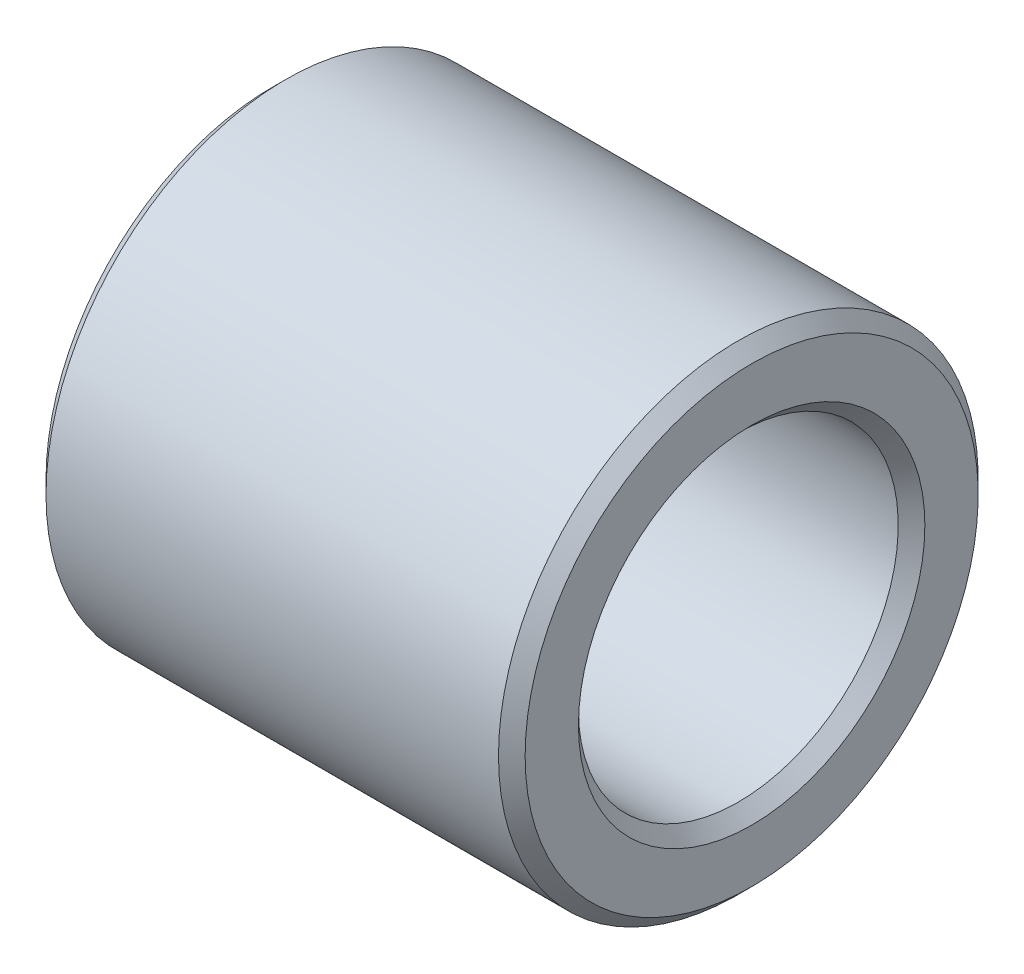
ISO-10303-21;
HEADER;
FILE_DESCRIPTION(('STEP AP214'),'2;1');
FILE_NAME('part.step','',(''),(''),'','','');
FILE_SCHEMA(('AUTOMOTIVE_DESIGN { 1 0 10303 214 1 1 1 1 }'));
ENDSEC;
DATA;
#1=APPLICATION_CONTEXT('core data for automotive mechanical design processes');
#2=APPLICATION_PROTOCOL_DEFINITION('international standard','automotive_design',2000,#1);
#3=PRODUCT_CONTEXT('',#1,'mechanical');
#4=PRODUCT('Part','Part','',(#3));
#5=PRODUCT_RELATED_PRODUCT_CATEGORY('part','',(#4));
#6=PRODUCT_DEFINITION_FORMATION('','',#4);
#7=PRODUCT_DEFINITION_CONTEXT('part definition',#1,'design');
#8=PRODUCT_DEFINITION('design','',#6,#7);
#9=PRODUCT_DEFINITION_SHAPE('','',#8);
#10=(LENGTH_UNIT() NAMED_UNIT(*) SI_UNIT(.MILLI.,.METRE.));
#11=(NAMED_UNIT(*) PLANE_ANGLE_UNIT() SI_UNIT($,.RADIAN.));
#12=(NAMED_UNIT(*) SI_UNIT($,.STERADIAN.) SOLID_ANGLE_UNIT());
#13=UNCERTAINTY_MEASURE_WITH_UNIT(LENGTH_MEASURE(1.E-05),#10,'distance_accuracy_value','');
#14=(GEOMETRIC_REPRESENTATION_CONTEXT(3) GLOBAL_UNCERTAINTY_ASSIGNED_CONTEXT((#13)) GLOBAL_UNIT_ASSIGNED_CONTEXT((#10,
#11,#12)) REPRESENTATION_CONTEXT('',''));
#15=CARTESIAN_POINT('',(0.,0.,0.));
#16=DIRECTION('',(0.,0.,1.));
#17=DIRECTION('',(1.,0.,0.));
#18=AXIS2_PLACEMENT_3D('',#15,#16,#17);
#19=CARTESIAN_POINT('',(-10.6550847457627,0.,0.));
#20=DIRECTION('',(-1.,0.,0.));
#21=DIRECTION('',(0.,0.,1.));
#22=AXIS2_PLACEMENT_3D('',#19,#20,#21);
#23=CYLINDRICAL_SURFACE('',#22,9.);
#24=CARTESIAN_POINT('',(0.5,0.,0.));
#25=DIRECTION('',(-1.,0.,0.));
#26=DIRECTION('',(0.,0.,1.));
#27=AXIS2_PLACEMENT_3D('',#24,#25,#26);
#28=CIRCLE('',#27,9.);
#29=CARTESIAN_POINT('',(0.5,0.,9.));
#30=VERTEX_POINT('',#29);
#31=EDGE_CURVE('E58',#30,#30,#28,.T.);
#32=ORIENTED_EDGE('',*,*,#31,.F.);
#33=EDGE_LOOP('',(#32));
#34=FACE_BOUND('',#33,.T.);
#35=CARTESIAN_POINT('',(17.48,0.,0.));
#36=DIRECTION('',(-1.,0.,0.));
#37=DIRECTION('',(0.,0.,1.));
#38=AXIS2_PLACEMENT_3D('',#35,#36,#37);
#39=CIRCLE('',#38,9.);
#40=CARTESIAN_POINT('',(17.48,0.,9.));
#41=VERTEX_POINT('',#40);
#42=EDGE_CURVE('E10',#41,#41,#39,.T.);
#43=ORIENTED_EDGE('',*,*,#42,.T.);
#44=EDGE_LOOP('',(#43));
#45=FACE_BOUND('',#44,.T.);
#46=ADVANCED_FACE('F30',(#34,#45),#23,.T.);
#47=CARTESIAN_POINT('',(17.98,0.,0.));
#48=DIRECTION('',(-1.,0.,0.));
#49=DIRECTION('',(0.,0.,1.));
#50=AXIS2_PLACEMENT_3D('',#47,#48,#49);
#51=CONICAL_SURFACE('',#50,8.5,0.785398163397448);
#52=ORIENTED_EDGE('',*,*,#42,.F.);
#53=EDGE_LOOP('',(#52));
#54=FACE_BOUND('',#53,.T.);
#55=CARTESIAN_POINT('',(17.98,0.,0.));
#56=DIRECTION('',(-1.,0.,0.));
#57=DIRECTION('',(0.,0.,1.));
#58=AXIS2_PLACEMENT_3D('',#55,#56,#57);
#59=CIRCLE('',#58,8.5);
#60=CARTESIAN_POINT('',(17.98,0.,8.5));
#61=VERTEX_POINT('',#60);
#62=EDGE_CURVE('E36',#61,#61,#59,.T.);
#63=ORIENTED_EDGE('',*,*,#62,.T.);
#64=EDGE_LOOP('',(#63));
#65=FACE_BOUND('',#64,.T.);
#66=ADVANCED_FACE('F65',(#54,#65),#51,.T.);
#67=CARTESIAN_POINT('',(17.98,8.5,0.));
#68=DIRECTION('',(-1.,0.,0.));
#69=DIRECTION('',(0.,0.,1.));
#70=AXIS2_PLACEMENT_3D('',#67,#68,#69);
#71=PLANE('',#70);
#72=ORIENTED_EDGE('',*,*,#62,.F.);
#73=EDGE_LOOP('',(#72));
#74=FACE_BOUND('',#73,.T.);
#75=CARTESIAN_POINT('',(17.98,0.,0.));
#76=DIRECTION('',(-1.,0.,0.));
#77=DIRECTION('',(0.,0.,1.));
#78=AXIS2_PLACEMENT_3D('',#75,#76,#77);
#79=CIRCLE('',#78,6.5);
#80=CARTESIAN_POINT('',(17.98,0.,6.5));
#81=VERTEX_POINT('',#80);
#82=EDGE_CURVE('E40',#81,#81,#79,.T.);
#83=ORIENTED_EDGE('',*,*,#82,.T.);
#84=EDGE_LOOP('',(#83));
#85=FACE_BOUND('',#84,.T.);
#86=ADVANCED_FACE('F69',(#74,#85),#71,.F.);
#87=CARTESIAN_POINT('',(17.48,0.,0.));
#88=DIRECTION('',(1.,0.,0.));
#89=DIRECTION('',(0.,0.,-1.));
#90=AXIS2_PLACEMENT_3D('',#87,#88,#89);
#91=CONICAL_SURFACE('',#90,6.,0.785398163397448);
#92=ORIENTED_EDGE('',*,*,#82,.F.);
#93=EDGE_LOOP('',(#92));
#94=FACE_BOUND('',#93,.T.);
#95=CARTESIAN_POINT('',(17.48,0.,0.));
#96=DIRECTION('',(-1.,0.,0.));
#97=DIRECTION('',(0.,0.,1.));
#98=AXIS2_PLACEMENT_3D('',#95,#96,#97);
#99=CIRCLE('',#98,6.);
#100=CARTESIAN_POINT('',(17.48,0.,6.));
#101=VERTEX_POINT('',#100);
#102=EDGE_CURVE('E44',#101,#101,#99,.T.);
#103=ORIENTED_EDGE('',*,*,#102,.T.);
#104=EDGE_LOOP('',(#103));
#105=FACE_BOUND('',#104,.T.);
#106=ADVANCED_FACE('F74',(#94,#105),#91,.F.);
#107=CARTESIAN_POINT('',(-10.6550847457627,0.,0.));
#108=DIRECTION('',(-1.,0.,0.));
#109=DIRECTION('',(0.,0.,1.));
#110=AXIS2_PLACEMENT_3D('',#107,#108,#109);
#111=CYLINDRICAL_SURFACE('',#110,6.);
#112=ORIENTED_EDGE('',*,*,#102,.F.);
#113=EDGE_LOOP('',(#112));
#114=FACE_BOUND('',#113,.T.);
#115=CARTESIAN_POINT('',(0.5,0.,0.));
#116=DIRECTION('',(-1.,0.,0.));
#117=DIRECTION('',(0.,0.,1.));
#118=AXIS2_PLACEMENT_3D('',#115,#116,#117);
#119=CIRCLE('',#118,6.);
#120=CARTESIAN_POINT('',(0.5,0.,6.));
#121=VERTEX_POINT('',#120);
#122=EDGE_CURVE('E49',#121,#121,#119,.T.);
#123=ORIENTED_EDGE('',*,*,#122,.T.);
#124=EDGE_LOOP('',(#123));
#125=FACE_BOUND('',#124,.T.);
#126=ADVANCED_FACE('F80',(#114,#125),#111,.F.);
#127=CARTESIAN_POINT('',(0.,0.,0.));
#128=DIRECTION('',(-1.,0.,0.));
#129=DIRECTION('',(0.,0.,1.));
#130=AXIS2_PLACEMENT_3D('',#127,#128,#129);
#131=CONICAL_SURFACE('',#130,6.5,0.785398163397448);
#132=ORIENTED_EDGE('',*,*,#122,.F.);
#133=EDGE_LOOP('',(#132));
#134=FACE_BOUND('',#133,.T.);
#135=CARTESIAN_POINT('',(0.,0.,0.));
#136=DIRECTION('',(-1.,0.,0.));
#137=DIRECTION('',(0.,0.,1.));
#138=AXIS2_PLACEMENT_3D('',#135,#136,#137);
#139=CIRCLE('',#138,6.5);
#140=CARTESIAN_POINT('',(0.,0.,6.5));
#141=VERTEX_POINT('',#140);
#142=EDGE_CURVE('E52',#141,#141,#139,.T.);
#143=ORIENTED_EDGE('',*,*,#142,.T.);
#144=EDGE_LOOP('',(#143));
#145=FACE_BOUND('',#144,.T.);
#146=ADVANCED_FACE('F84',(#134,#145),#131,.F.);
#147=CARTESIAN_POINT('',(0.,8.5,0.));
#148=DIRECTION('',(1.,0.,0.));
#149=DIRECTION('',(0.,0.,-1.));
#150=AXIS2_PLACEMENT_3D('',#147,#148,#149);
#151=PLANE('',#150);
#152=ORIENTED_EDGE('',*,*,#142,.F.);
#153=EDGE_LOOP('',(#152));
#154=FACE_BOUND('',#153,.T.);
#155=CARTESIAN_POINT('',(0.,0.,0.));
#156=DIRECTION('',(-1.,0.,0.));
#157=DIRECTION('',(0.,0.,1.));
#158=AXIS2_PLACEMENT_3D('',#155,#156,#157);
#159=CIRCLE('',#158,8.5);
#160=CARTESIAN_POINT('',(0.,0.,8.5));
#161=VERTEX_POINT('',#160);
#162=EDGE_CURVE('E55',#161,#161,#159,.T.);
#163=ORIENTED_EDGE('',*,*,#162,.T.);
#164=EDGE_LOOP('',(#163));
#165=FACE_BOUND('',#164,.T.);
#166=ADVANCED_FACE('F88',(#154,#165),#151,.F.);
#167=CARTESIAN_POINT('',(0.5,0.,0.));
#168=DIRECTION('',(1.,0.,0.));
#169=DIRECTION('',(0.,0.,-1.));
#170=AXIS2_PLACEMENT_3D('',#167,#168,#169);
#171=CONICAL_SURFACE('',#170,9.,0.785398163397448);
#172=ORIENTED_EDGE('',*,*,#162,.F.);
#173=EDGE_LOOP('',(#172));
#174=FACE_BOUND('',#173,.T.);
#175=ORIENTED_EDGE('',*,*,#31,.T.);
#176=EDGE_LOOP('',(#175));
#177=FACE_BOUND('',#176,.T.);
#178=ADVANCED_FACE('F62',(#174,#177),#171,.T.);
#179=CLOSED_SHELL('',(#46,#66,#86,#106,#126,#146,#166,#178));
#180=MANIFOLD_SOLID_BREP('B2',#179);
#181=ADVANCED_BREP_SHAPE_REPRESENTATION('',(#18,#180),#14);
#182=SHAPE_DEFINITION_REPRESENTATION(#9,#181);
ENDSEC;
END-ISO-10303-21;
